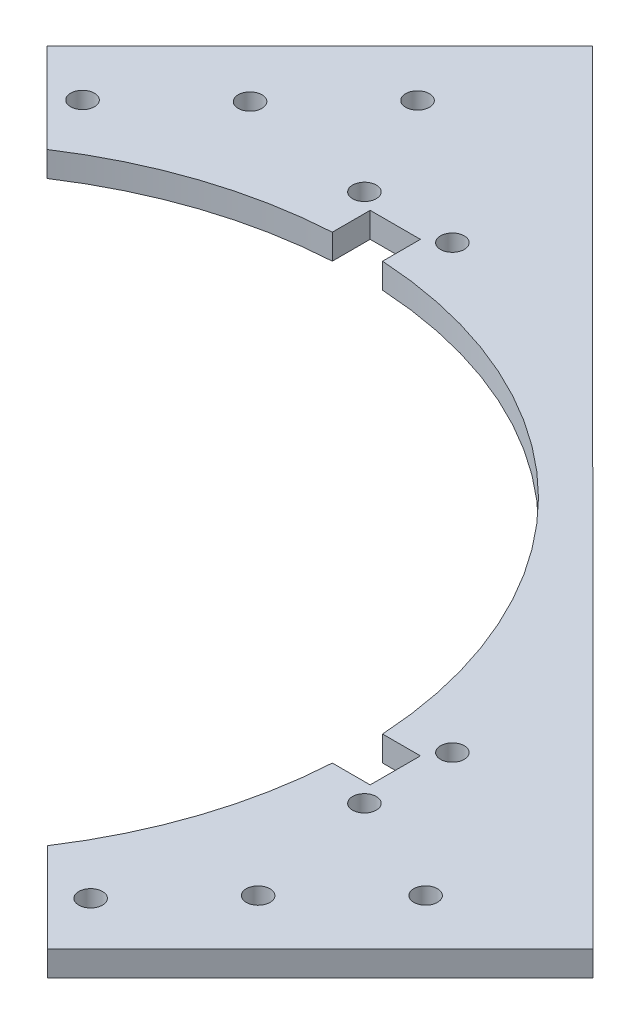
ISO-10303-21;
HEADER;
FILE_DESCRIPTION(('STEP AP214'),'2;1');
FILE_NAME('part.step','',(''),(''),'','','');
FILE_SCHEMA(('AUTOMOTIVE_DESIGN { 1 0 10303 214 1 1 1 1 }'));
ENDSEC;
DATA;
#1=APPLICATION_CONTEXT('core data for automotive mechanical design processes');
#2=APPLICATION_PROTOCOL_DEFINITION('international standard','automotive_design',2000,#1);
#3=PRODUCT_CONTEXT('',#1,'mechanical');
#4=PRODUCT('Part','Part','',(#3));
#5=PRODUCT_RELATED_PRODUCT_CATEGORY('part','',(#4));
#6=PRODUCT_DEFINITION_FORMATION('','',#4);
#7=PRODUCT_DEFINITION_CONTEXT('part definition',#1,'design');
#8=PRODUCT_DEFINITION('design','',#6,#7);
#9=PRODUCT_DEFINITION_SHAPE('','',#8);
#10=(LENGTH_UNIT() NAMED_UNIT(*) SI_UNIT(.MILLI.,.METRE.));
#11=(NAMED_UNIT(*) PLANE_ANGLE_UNIT() SI_UNIT($,.RADIAN.));
#12=(NAMED_UNIT(*) SI_UNIT($,.STERADIAN.) SOLID_ANGLE_UNIT());
#13=UNCERTAINTY_MEASURE_WITH_UNIT(LENGTH_MEASURE(1.E-05),#10,'distance_accuracy_value','');
#14=(GEOMETRIC_REPRESENTATION_CONTEXT(3) GLOBAL_UNCERTAINTY_ASSIGNED_CONTEXT((#13)) GLOBAL_UNIT_ASSIGNED_CONTEXT((#10,
#11,#12)) REPRESENTATION_CONTEXT('',''));
#15=CARTESIAN_POINT('',(0.,0.,0.));
#16=DIRECTION('',(0.,0.,1.));
#17=DIRECTION('',(1.,0.,0.));
#18=AXIS2_PLACEMENT_3D('',#15,#16,#17);
#19=CARTESIAN_POINT('',(0.,3.175,0.));
#20=DIRECTION('',(0.,1.,0.));
#21=DIRECTION('',(0.,0.,1.));
#22=AXIS2_PLACEMENT_3D('',#19,#20,#21);
#23=PLANE('',#22);
#24=DIRECTION('',(-0.707443172401365,0.,-0.706770229864482));
#25=VECTOR('',#24,1.);
#26=CARTESIAN_POINT('',(57.2688897716044,3.175,41.5064383027239));
#27=LINE('',#26,#25);
#28=CARTESIAN_POINT('',(57.2688897716044,3.175,41.5064383027239));
#29=VERTEX_POINT('',#28);
#30=CARTESIAN_POINT('',(45.9608973819119,3.175,30.2092024364988));
#31=VERTEX_POINT('',#30);
#32=EDGE_CURVE('E138',#29,#31,#27,.T.);
#33=ORIENTED_EDGE('',*,*,#32,.F.);
#34=DIRECTION('',(0.706770229864482,0.,-0.707443172401365));
#35=VECTOR('',#34,1.);
#36=CARTESIAN_POINT('',(49.4149055922353,3.175,49.3679005560341));
#37=LINE('',#36,#35);
#38=CARTESIAN_POINT('',(91.7151038496246,3.175,7.02742668781241));
#39=VERTEX_POINT('',#38);
#40=EDGE_CURVE('E149',#29,#39,#37,.T.);
#41=ORIENTED_EDGE('',*,*,#40,.T.);
#42=DIRECTION('',(0.707443172401365,0.,0.706770229864482));
#43=VECTOR('',#42,1.);
#44=CARTESIAN_POINT('',(91.7151038496246,3.175,7.02742668781241));
#45=LINE('',#44,#43);
#46=CARTESIAN_POINT('',(-7.11470733484609,3.175,-91.7083744242558));
#47=VERTEX_POINT('',#46);
#48=EDGE_CURVE('E271',#47,#39,#45,.T.);
#49=ORIENTED_EDGE('',*,*,#48,.F.);
#50=DIRECTION('',(0.706770229864482,0.,-0.707443172401365));
#51=VECTOR('',#50,1.);
#52=CARTESIAN_POINT('',(-49.4149055922353,3.175,-49.3679005560341));
#53=LINE('',#52,#51);
#54=CARTESIAN_POINT('',(-41.5609214128663,3.175,-57.2293628093442));
#55=VERTEX_POINT('',#54);
#56=EDGE_CURVE('E157',#55,#47,#53,.T.);
#57=ORIENTED_EDGE('',*,*,#56,.F.);
#58=CARTESIAN_POINT('',(-30.2529290231738,3.175,-45.9321269431191));
#59=VERTEX_POINT('',#58);
#60=EDGE_CURVE('E60',#59,#55,#27,.T.);
#61=ORIENTED_EDGE('',*,*,#60,.F.);
#62=CARTESIAN_POINT('',(0.,3.175,0.));
#63=DIRECTION('',(0.,1.,0.));
#64=DIRECTION('',(0.,0.,1.));
#65=AXIS2_PLACEMENT_3D('',#62,#63,#64);
#66=CIRCLE('',#65,55.);
#67=CARTESIAN_POINT('',(-3.175,3.175,-54.9082814792086));
#68=VERTEX_POINT('',#67);
#69=EDGE_CURVE('E174',#68,#59,#66,.T.);
#70=ORIENTED_EDGE('',*,*,#69,.F.);
#71=DIRECTION('',(0.,0.,1.));
#72=VECTOR('',#71,1.);
#73=CARTESIAN_POINT('',(-3.175,3.175,-53.34));
#74=LINE('',#73,#72);
#75=CARTESIAN_POINT('',(-3.175,3.175,-59.69));
#76=VERTEX_POINT('',#75);
#77=EDGE_CURVE('E237',#76,#68,#74,.T.);
#78=ORIENTED_EDGE('',*,*,#77,.F.);
#79=DIRECTION('',(-1.,0.,0.));
#80=VECTOR('',#79,1.);
#81=CARTESIAN_POINT('',(3.175,3.175,-59.69));
#82=LINE('',#81,#80);
#83=CARTESIAN_POINT('',(3.175,3.175,-59.69));
#84=VERTEX_POINT('',#83);
#85=EDGE_CURVE('E317',#84,#76,#82,.T.);
#86=ORIENTED_EDGE('',*,*,#85,.F.);
#87=DIRECTION('',(0.,0.,-1.));
#88=VECTOR('',#87,1.);
#89=CARTESIAN_POINT('',(3.175,3.175,-53.34));
#90=LINE('',#89,#88);
#91=CARTESIAN_POINT('',(3.175,3.175,-54.9082814792086));
#92=VERTEX_POINT('',#91);
#93=EDGE_CURVE('E315',#92,#84,#90,.T.);
#94=ORIENTED_EDGE('',*,*,#93,.F.);
#95=CARTESIAN_POINT('',(54.9082814792086,3.175,-3.17499999999981));
#96=VERTEX_POINT('',#95);
#97=EDGE_CURVE('E177',#96,#92,#66,.T.);
#98=ORIENTED_EDGE('',*,*,#97,.F.);
#99=DIRECTION('',(-1.,0.,0.));
#100=VECTOR('',#99,1.);
#101=CARTESIAN_POINT('',(53.3400000000014,3.175,-3.17499999999981));
#102=LINE('',#101,#100);
#103=CARTESIAN_POINT('',(59.6900000000014,3.175,-3.17499999999981));
#104=VERTEX_POINT('',#103);
#105=EDGE_CURVE('E325',#104,#96,#102,.T.);
#106=ORIENTED_EDGE('',*,*,#105,.F.);
#107=DIRECTION('',(0.,0.,-1.));
#108=VECTOR('',#107,1.);
#109=CARTESIAN_POINT('',(59.6900000000014,3.175,3.17500000000019));
#110=LINE('',#109,#108);
#111=CARTESIAN_POINT('',(59.6900000000014,3.175,3.17500000000019));
#112=VERTEX_POINT('',#111);
#113=EDGE_CURVE('E328',#112,#104,#110,.T.);
#114=ORIENTED_EDGE('',*,*,#113,.F.);
#115=DIRECTION('',(1.,0.,0.));
#116=VECTOR('',#115,1.);
#117=CARTESIAN_POINT('',(53.3400000000014,3.175,3.17500000000019));
#118=LINE('',#117,#116);
#119=CARTESIAN_POINT('',(54.9082814792086,3.175,3.17500000000019));
#120=VERTEX_POINT('',#119);
#121=EDGE_CURVE('E311',#120,#112,#118,.T.);
#122=ORIENTED_EDGE('',*,*,#121,.F.);
#123=EDGE_CURVE('E152',#31,#120,#66,.T.);
#124=ORIENTED_EDGE('',*,*,#123,.F.);
#125=EDGE_LOOP('',(#33,#41,#49,#57,#61,#70,#78,#86,#94,#98,#106,#114,#122,#124));
#126=FACE_BOUND('',#125,.T.);
#127=CARTESIAN_POINT('',(75.300110897104,3.175,11.7781569073365));
#128=DIRECTION('',(0.,1.,0.));
#129=DIRECTION('',(0.,0.,1.));
#130=AXIS2_PLACEMENT_3D('',#127,#128,#129);
#131=CIRCLE('',#130,1.5);
#132=CARTESIAN_POINT('',(75.300110897104,3.175,13.2781569073365));
#133=VERTEX_POINT('',#132);
#134=EDGE_CURVE('E272',#133,#133,#131,.T.);
#135=ORIENTED_EDGE('',*,*,#134,.F.);
#136=EDGE_LOOP('',(#135));
#137=FACE_BOUND('',#136,.T.);
#138=CARTESIAN_POINT('',(-12.2022381603849,3.175,-74.7025636613189));
#139=DIRECTION('',(0.,-1.,0.));
#140=DIRECTION('',(0.,0.,-1.));
#141=AXIS2_PLACEMENT_3D('',#138,#139,#140);
#142=CIRCLE('',#141,1.5);
#143=CARTESIAN_POINT('',(-12.2022381603849,3.175,-76.2025636613189));
#144=VERTEX_POINT('',#143);
#145=EDGE_CURVE('E276',#144,#144,#142,.T.);
#146=ORIENTED_EDGE('',*,*,#145,.T.);
#147=EDGE_LOOP('',(#146));
#148=FACE_BOUND('',#147,.T.);
#149=CARTESIAN_POINT('',(61.346730494,3.175,5.55625));
#150=DIRECTION('',(0.,1.,0.));
#151=DIRECTION('',(0.,0.,1.));
#152=AXIS2_PLACEMENT_3D('',#149,#150,#151);
#153=CIRCLE('',#152,1.5);
#154=CARTESIAN_POINT('',(61.346730494,3.175,7.05625));
#155=VERTEX_POINT('',#154);
#156=EDGE_CURVE('E180',#155,#155,#153,.T.);
#157=ORIENTED_EDGE('',*,*,#156,.F.);
#158=EDGE_LOOP('',(#157));
#159=FACE_BOUND('',#158,.T.);
#160=CARTESIAN_POINT('',(61.346730494,3.175,-5.55625));
#161=DIRECTION('',(0.,1.,0.));
#162=DIRECTION('',(0.,0.,1.));
#163=AXIS2_PLACEMENT_3D('',#160,#161,#162);
#164=CIRCLE('',#163,1.5);
#165=CARTESIAN_POINT('',(61.346730494,3.175,-4.05625));
#166=VERTEX_POINT('',#165);
#167=EDGE_CURVE('E176',#166,#166,#164,.T.);
#168=ORIENTED_EDGE('',*,*,#167,.F.);
#169=EDGE_LOOP('',(#168));
#170=FACE_BOUND('',#169,.T.);
#171=CARTESIAN_POINT('',(5.55625,3.175,-61.346730494));
#172=DIRECTION('',(0.,1.,0.));
#173=DIRECTION('',(0.,0.,1.));
#174=AXIS2_PLACEMENT_3D('',#171,#172,#173);
#175=CIRCLE('',#174,1.5);
#176=CARTESIAN_POINT('',(5.55625,3.175,-59.846730494));
#177=VERTEX_POINT('',#176);
#178=EDGE_CURVE('E171',#177,#177,#175,.T.);
#179=ORIENTED_EDGE('',*,*,#178,.F.);
#180=EDGE_LOOP('',(#179));
#181=FACE_BOUND('',#180,.T.);
#182=CARTESIAN_POINT('',(-5.55625,3.175,-61.346730494));
#183=DIRECTION('',(0.,1.,0.));
#184=DIRECTION('',(0.,0.,1.));
#185=AXIS2_PLACEMENT_3D('',#182,#183,#184);
#186=CIRCLE('',#185,1.5);
#187=CARTESIAN_POINT('',(-5.55625,3.175,-59.846730494));
#188=VERTEX_POINT('',#187);
#189=EDGE_CURVE('E160',#188,#188,#186,.T.);
#190=ORIENTED_EDGE('',*,*,#189,.F.);
#191=EDGE_LOOP('',(#190));
#192=FACE_BOUND('',#191,.T.);
#193=CARTESIAN_POINT('',(54.443600684956,3.175,33.2417034868411));
#194=DIRECTION('',(0.,1.,0.));
#195=DIRECTION('',(0.,0.,1.));
#196=AXIS2_PLACEMENT_3D('',#193,#194,#195);
#197=CIRCLE('',#196,1.5);
#198=CARTESIAN_POINT('',(54.443600684956,3.175,34.7417034868411));
#199=VERTEX_POINT('',#198);
#200=EDGE_CURVE('E289',#199,#199,#197,.T.);
#201=ORIENTED_EDGE('',*,*,#200,.F.);
#202=EDGE_LOOP('',(#201));
#203=FACE_BOUND('',#202,.T.);
#204=CARTESIAN_POINT('',(64.7250613327567,3.175,22.3632753743919));
#205=DIRECTION('',(0.,1.,0.));
#206=DIRECTION('',(0.,0.,1.));
#207=AXIS2_PLACEMENT_3D('',#204,#205,#206);
#208=CIRCLE('',#207,1.5);
#209=CARTESIAN_POINT('',(64.7250613327567,3.175,23.8632753743919));
#210=VERTEX_POINT('',#209);
#211=EDGE_CURVE('E275',#210,#210,#208,.T.);
#212=ORIENTED_EDGE('',*,*,#211,.F.);
#213=EDGE_LOOP('',(#212));
#214=FACE_BOUND('',#213,.T.);
#215=CARTESIAN_POINT('',(-22.6624376065215,3.175,-64.003936001799));
#216=DIRECTION('',(0.,-1.,0.));
#217=DIRECTION('',(0.,0.,-1.));
#218=AXIS2_PLACEMENT_3D('',#215,#216,#217);
#219=CIRCLE('',#218,1.5);
#220=CARTESIAN_POINT('',(-22.6624376065215,3.175,-65.503936001799));
#221=VERTEX_POINT('',#220);
#222=EDGE_CURVE('E295',#221,#221,#219,.T.);
#223=ORIENTED_EDGE('',*,*,#222,.T.);
#224=EDGE_LOOP('',(#223));
#225=FACE_BOUND('',#224,.T.);
#226=CARTESIAN_POINT('',(-33.4193742609255,3.175,-53.5954325040266));
#227=DIRECTION('',(0.,-1.,0.));
#228=DIRECTION('',(0.,0.,-1.));
#229=AXIS2_PLACEMENT_3D('',#226,#227,#228);
#230=CIRCLE('',#229,1.50000000000001);
#231=CARTESIAN_POINT('',(-33.4193742609255,3.175,-55.0954325040266));
#232=VERTEX_POINT('',#231);
#233=EDGE_CURVE('E283',#232,#232,#230,.T.);
#234=ORIENTED_EDGE('',*,*,#233,.T.);
#235=EDGE_LOOP('',(#234));
#236=FACE_BOUND('',#235,.T.);
#237=ADVANCED_FACE('F37',(#126,#137,#148,#159,#170,#181,#192,#203,#214,#225,#236),#23,.T.);
#238=CARTESIAN_POINT('',(0.,0.,0.));
#239=DIRECTION('',(0.,1.,0.));
#240=DIRECTION('',(0.,0.,1.));
#241=AXIS2_PLACEMENT_3D('',#238,#239,#240);
#242=PLANE('',#241);
#243=CARTESIAN_POINT('',(75.300110897104,0.,11.7781569073365));
#244=DIRECTION('',(0.,1.,0.));
#245=DIRECTION('',(0.,0.,1.));
#246=AXIS2_PLACEMENT_3D('',#243,#244,#245);
#247=CIRCLE('',#246,1.5);
#248=CARTESIAN_POINT('',(75.300110897104,0.,13.2781569073365));
#249=VERTEX_POINT('',#248);
#250=EDGE_CURVE('E268',#249,#249,#247,.T.);
#251=ORIENTED_EDGE('',*,*,#250,.T.);
#252=EDGE_LOOP('',(#251));
#253=FACE_BOUND('',#252,.T.);
#254=CARTESIAN_POINT('',(64.7250613327567,0.,22.3632753743919));
#255=DIRECTION('',(0.,1.,0.));
#256=DIRECTION('',(0.,0.,1.));
#257=AXIS2_PLACEMENT_3D('',#254,#255,#256);
#258=CIRCLE('',#257,1.5);
#259=CARTESIAN_POINT('',(64.7250613327567,0.,23.8632753743919));
#260=VERTEX_POINT('',#259);
#261=EDGE_CURVE('E292',#260,#260,#258,.T.);
#262=ORIENTED_EDGE('',*,*,#261,.T.);
#263=EDGE_LOOP('',(#262));
#264=FACE_BOUND('',#263,.T.);
#265=CARTESIAN_POINT('',(54.443600684956,0.,33.2417034868411));
#266=DIRECTION('',(0.,1.,0.));
#267=DIRECTION('',(0.,0.,1.));
#268=AXIS2_PLACEMENT_3D('',#265,#266,#267);
#269=CIRCLE('',#268,1.5);
#270=CARTESIAN_POINT('',(54.443600684956,0.,34.7417034868411));
#271=VERTEX_POINT('',#270);
#272=EDGE_CURVE('E302',#271,#271,#269,.T.);
#273=ORIENTED_EDGE('',*,*,#272,.T.);
#274=EDGE_LOOP('',(#273));
#275=FACE_BOUND('',#274,.T.);
#276=CARTESIAN_POINT('',(-5.55625,0.,-61.346730494));
#277=DIRECTION('',(0.,1.,0.));
#278=DIRECTION('',(0.,0.,1.));
#279=AXIS2_PLACEMENT_3D('',#276,#277,#278);
#280=CIRCLE('',#279,1.5);
#281=CARTESIAN_POINT('',(-5.55625,0.,-59.846730494));
#282=VERTEX_POINT('',#281);
#283=EDGE_CURVE('E187',#282,#282,#280,.T.);
#284=ORIENTED_EDGE('',*,*,#283,.T.);
#285=EDGE_LOOP('',(#284));
#286=FACE_BOUND('',#285,.T.);
#287=CARTESIAN_POINT('',(5.55625,0.,-61.346730494));
#288=DIRECTION('',(0.,1.,0.));
#289=DIRECTION('',(0.,0.,1.));
#290=AXIS2_PLACEMENT_3D('',#287,#288,#289);
#291=CIRCLE('',#290,1.5);
#292=CARTESIAN_POINT('',(5.55625,0.,-59.846730494));
#293=VERTEX_POINT('',#292);
#294=EDGE_CURVE('E190',#293,#293,#291,.T.);
#295=ORIENTED_EDGE('',*,*,#294,.T.);
#296=EDGE_LOOP('',(#295));
#297=FACE_BOUND('',#296,.T.);
#298=DIRECTION('',(0.706770229864482,0.,-0.707443172401365));
#299=VECTOR('',#298,1.);
#300=CARTESIAN_POINT('',(49.4149055922353,0.,49.3679005560341));
#301=LINE('',#300,#299);
#302=CARTESIAN_POINT('',(57.2688897716044,0.,41.5064383027239));
#303=VERTEX_POINT('',#302);
#304=CARTESIAN_POINT('',(91.7151038496246,0.,7.0274266878124));
#305=VERTEX_POINT('',#304);
#306=EDGE_CURVE('E183',#303,#305,#301,.T.);
#307=ORIENTED_EDGE('',*,*,#306,.F.);
#308=DIRECTION('',(-0.707443172401365,0.,-0.706770229864482));
#309=VECTOR('',#308,1.);
#310=CARTESIAN_POINT('',(7.85398417936903,0.,-7.86146225331015));
#311=LINE('',#310,#309);
#312=CARTESIAN_POINT('',(45.9608973819119,0.,30.2092024364988));
#313=VERTEX_POINT('',#312);
#314=EDGE_CURVE('E52',#303,#313,#311,.T.);
#315=ORIENTED_EDGE('',*,*,#314,.T.);
#316=CARTESIAN_POINT('',(0.,0.,0.));
#317=DIRECTION('',(0.,1.,0.));
#318=DIRECTION('',(0.,0.,1.));
#319=AXIS2_PLACEMENT_3D('',#316,#317,#318);
#320=CIRCLE('',#319,55.);
#321=CARTESIAN_POINT('',(54.9082814792086,0.,3.17500000000019));
#322=VERTEX_POINT('',#321);
#323=EDGE_CURVE('E194',#313,#322,#320,.T.);
#324=ORIENTED_EDGE('',*,*,#323,.T.);
#325=DIRECTION('',(1.,0.,0.));
#326=VECTOR('',#325,1.);
#327=CARTESIAN_POINT('',(0.,0.,3.17500000000019));
#328=LINE('',#327,#326);
#329=CARTESIAN_POINT('',(59.6900000000014,0.,3.17500000000019));
#330=VERTEX_POINT('',#329);
#331=EDGE_CURVE('E45',#322,#330,#328,.T.);
#332=ORIENTED_EDGE('',*,*,#331,.T.);
#333=DIRECTION('',(0.,0.,-1.));
#334=VECTOR('',#333,1.);
#335=CARTESIAN_POINT('',(59.6900000000014,0.,3.17500000000019));
#336=LINE('',#335,#334);
#337=CARTESIAN_POINT('',(59.6900000000014,0.,-3.17499999999981));
#338=VERTEX_POINT('',#337);
#339=EDGE_CURVE('E205',#330,#338,#336,.T.);
#340=ORIENTED_EDGE('',*,*,#339,.T.);
#341=DIRECTION('',(-1.,0.,0.));
#342=VECTOR('',#341,1.);
#343=CARTESIAN_POINT('',(59.6900000000014,0.,-3.17499999999981));
#344=LINE('',#343,#342);
#345=CARTESIAN_POINT('',(54.9082814792086,0.,-3.17499999999981));
#346=VERTEX_POINT('',#345);
#347=EDGE_CURVE('E252',#338,#346,#344,.T.);
#348=ORIENTED_EDGE('',*,*,#347,.T.);
#349=CARTESIAN_POINT('',(3.175,0.,-54.9082814792086));
#350=VERTEX_POINT('',#349);
#351=EDGE_CURVE('E196',#346,#350,#320,.T.);
#352=ORIENTED_EDGE('',*,*,#351,.T.);
#353=DIRECTION('',(0.,0.,-1.));
#354=VECTOR('',#353,1.);
#355=CARTESIAN_POINT('',(3.175,0.,0.));
#356=LINE('',#355,#354);
#357=CARTESIAN_POINT('',(3.175,0.,-59.69));
#358=VERTEX_POINT('',#357);
#359=EDGE_CURVE('E11',#350,#358,#356,.T.);
#360=ORIENTED_EDGE('',*,*,#359,.T.);
#361=DIRECTION('',(-1.,0.,0.));
#362=VECTOR('',#361,1.);
#363=CARTESIAN_POINT('',(3.175,0.,-59.69));
#364=LINE('',#363,#362);
#365=CARTESIAN_POINT('',(-3.175,0.,-59.69));
#366=VERTEX_POINT('',#365);
#367=EDGE_CURVE('E244',#358,#366,#364,.T.);
#368=ORIENTED_EDGE('',*,*,#367,.T.);
#369=DIRECTION('',(0.,0.,1.));
#370=VECTOR('',#369,1.);
#371=CARTESIAN_POINT('',(-3.175,0.,-59.69));
#372=LINE('',#371,#370);
#373=CARTESIAN_POINT('',(-3.175,0.,-54.9082814792086));
#374=VERTEX_POINT('',#373);
#375=EDGE_CURVE('E234',#366,#374,#372,.T.);
#376=ORIENTED_EDGE('',*,*,#375,.T.);
#377=CARTESIAN_POINT('',(-30.2529290231738,0.,-45.9321269431191));
#378=VERTEX_POINT('',#377);
#379=EDGE_CURVE('E193',#374,#378,#320,.T.);
#380=ORIENTED_EDGE('',*,*,#379,.T.);
#381=CARTESIAN_POINT('',(-41.5609214128663,0.,-57.2293628093442));
#382=VERTEX_POINT('',#381);
#383=EDGE_CURVE('E266',#378,#382,#311,.T.);
#384=ORIENTED_EDGE('',*,*,#383,.T.);
#385=DIRECTION('',(0.706770229864482,0.,-0.707443172401365));
#386=VECTOR('',#385,1.);
#387=CARTESIAN_POINT('',(-49.4149055922353,0.,-49.3679005560341));
#388=LINE('',#387,#386);
#389=CARTESIAN_POINT('',(-7.11470733484609,0.,-91.7083744242558));
#390=VERTEX_POINT('',#389);
#391=EDGE_CURVE('E185',#382,#390,#388,.T.);
#392=ORIENTED_EDGE('',*,*,#391,.T.);
#393=DIRECTION('',(0.707443172401365,0.,0.706770229864482));
#394=VECTOR('',#393,1.);
#395=CARTESIAN_POINT('',(91.7151038496246,0.,7.02742668781241));
#396=LINE('',#395,#394);
#397=EDGE_CURVE('E305',#390,#305,#396,.T.);
#398=ORIENTED_EDGE('',*,*,#397,.T.);
#399=EDGE_LOOP('',(#307,#315,#324,#332,#340,#348,#352,#360,#368,#376,#380,#384,#392,#398));
#400=FACE_BOUND('',#399,.T.);
#401=CARTESIAN_POINT('',(61.346730494,0.,-5.55625));
#402=DIRECTION('',(0.,1.,0.));
#403=DIRECTION('',(0.,0.,1.));
#404=AXIS2_PLACEMENT_3D('',#401,#402,#403);
#405=CIRCLE('',#404,1.5);
#406=CARTESIAN_POINT('',(61.346730494,0.,-4.05625));
#407=VERTEX_POINT('',#406);
#408=EDGE_CURVE('E163',#407,#407,#405,.T.);
#409=ORIENTED_EDGE('',*,*,#408,.T.);
#410=EDGE_LOOP('',(#409));
#411=FACE_BOUND('',#410,.T.);
#412=CARTESIAN_POINT('',(61.346730494,0.,5.55625));
#413=DIRECTION('',(0.,1.,0.));
#414=DIRECTION('',(0.,0.,1.));
#415=AXIS2_PLACEMENT_3D('',#412,#413,#414);
#416=CIRCLE('',#415,1.5);
#417=CARTESIAN_POINT('',(61.346730494,0.,7.05625));
#418=VERTEX_POINT('',#417);
#419=EDGE_CURVE('E158',#418,#418,#416,.T.);
#420=ORIENTED_EDGE('',*,*,#419,.T.);
#421=EDGE_LOOP('',(#420));
#422=FACE_BOUND('',#421,.T.);
#423=CARTESIAN_POINT('',(-22.6624376065215,0.,-64.003936001799));
#424=DIRECTION('',(0.,-1.,0.));
#425=DIRECTION('',(0.,0.,-1.));
#426=AXIS2_PLACEMENT_3D('',#423,#424,#425);
#427=CIRCLE('',#426,1.5);
#428=CARTESIAN_POINT('',(-22.6624376065215,0.,-65.503936001799));
#429=VERTEX_POINT('',#428);
#430=EDGE_CURVE('E279',#429,#429,#427,.T.);
#431=ORIENTED_EDGE('',*,*,#430,.F.);
#432=EDGE_LOOP('',(#431));
#433=FACE_BOUND('',#432,.T.);
#434=CARTESIAN_POINT('',(-12.2022381603849,0.,-74.7025636613189));
#435=DIRECTION('',(0.,-1.,0.));
#436=DIRECTION('',(0.,0.,-1.));
#437=AXIS2_PLACEMENT_3D('',#434,#435,#436);
#438=CIRCLE('',#437,1.5);
#439=CARTESIAN_POINT('',(-12.2022381603849,0.,-76.2025636613189));
#440=VERTEX_POINT('',#439);
#441=EDGE_CURVE('E280',#440,#440,#438,.T.);
#442=ORIENTED_EDGE('',*,*,#441,.F.);
#443=EDGE_LOOP('',(#442));
#444=FACE_BOUND('',#443,.T.);
#445=CARTESIAN_POINT('',(-33.4193742609255,0.,-53.5954325040266));
#446=DIRECTION('',(0.,-1.,0.));
#447=DIRECTION('',(0.,0.,-1.));
#448=AXIS2_PLACEMENT_3D('',#445,#446,#447);
#449=CIRCLE('',#448,1.50000000000001);
#450=CARTESIAN_POINT('',(-33.4193742609255,0.,-55.0954325040266));
#451=VERTEX_POINT('',#450);
#452=EDGE_CURVE('E286',#451,#451,#449,.T.);
#453=ORIENTED_EDGE('',*,*,#452,.F.);
#454=EDGE_LOOP('',(#453));
#455=FACE_BOUND('',#454,.T.);
#456=ADVANCED_FACE('F202',(#253,#264,#275,#286,#297,#400,#411,#422,#433,#444,#455),#242,.F.);
#457=CARTESIAN_POINT('',(0.,3.175,0.));
#458=DIRECTION('',(0.,-1.,0.));
#459=DIRECTION('',(0.,0.,-1.));
#460=AXIS2_PLACEMENT_3D('',#457,#458,#459);
#461=CYLINDRICAL_SURFACE('',#460,55.);
#462=DIRECTION('',(0.,-1.,0.));
#463=VECTOR('',#462,1.);
#464=CARTESIAN_POINT('',(-30.2529290231738,3.175,-45.9321269431191));
#465=LINE('',#464,#463);
#466=EDGE_CURVE('E248',#378,#59,#465,.F.);
#467=ORIENTED_EDGE('',*,*,#466,.F.);
#468=ORIENTED_EDGE('',*,*,#379,.F.);
#469=DIRECTION('',(0.,-1.,0.));
#470=VECTOR('',#469,1.);
#471=CARTESIAN_POINT('',(-3.175,3.175,-54.9082814792086));
#472=LINE('',#471,#470);
#473=EDGE_CURVE('E166',#68,#374,#472,.T.);
#474=ORIENTED_EDGE('',*,*,#473,.F.);
#475=ORIENTED_EDGE('',*,*,#69,.T.);
#476=EDGE_LOOP('',(#467,#468,#474,#475));
#477=FACE_BOUND('',#476,.T.);
#478=ADVANCED_FACE('F247',(#477),#461,.F.);
#479=DIRECTION('',(0.,-1.,0.));
#480=VECTOR('',#479,1.);
#481=CARTESIAN_POINT('',(3.175,3.175,-54.9082814792086));
#482=LINE('',#481,#480);
#483=EDGE_CURVE('E220',#350,#92,#482,.F.);
#484=ORIENTED_EDGE('',*,*,#483,.F.);
#485=ORIENTED_EDGE('',*,*,#351,.F.);
#486=DIRECTION('',(0.,-1.,0.));
#487=VECTOR('',#486,1.);
#488=CARTESIAN_POINT('',(54.9082814792086,3.175,-3.17499999999981));
#489=LINE('',#488,#487);
#490=EDGE_CURVE('E217',#96,#346,#489,.T.);
#491=ORIENTED_EDGE('',*,*,#490,.F.);
#492=ORIENTED_EDGE('',*,*,#97,.T.);
#493=EDGE_LOOP('',(#484,#485,#491,#492));
#494=FACE_BOUND('',#493,.T.);
#495=ADVANCED_FACE('F255',(#494),#461,.F.);
#496=DIRECTION('',(0.,-1.,0.));
#497=VECTOR('',#496,1.);
#498=CARTESIAN_POINT('',(45.9608973819119,3.175,30.2092024364988));
#499=LINE('',#498,#497);
#500=EDGE_CURVE('E262',#31,#313,#499,.T.);
#501=ORIENTED_EDGE('',*,*,#500,.F.);
#502=ORIENTED_EDGE('',*,*,#123,.T.);
#503=DIRECTION('',(0.,-1.,0.));
#504=VECTOR('',#503,1.);
#505=CARTESIAN_POINT('',(54.9082814792086,3.175,3.17500000000019));
#506=LINE('',#505,#504);
#507=EDGE_CURVE('E212',#322,#120,#506,.F.);
#508=ORIENTED_EDGE('',*,*,#507,.F.);
#509=ORIENTED_EDGE('',*,*,#323,.F.);
#510=EDGE_LOOP('',(#501,#502,#508,#509));
#511=FACE_BOUND('',#510,.T.);
#512=ADVANCED_FACE('F216',(#511),#461,.F.);
#513=CARTESIAN_POINT('',(49.4149055922353,3.175,49.3679005560341));
#514=DIRECTION('',(-0.707443172401365,0.,-0.706770229864482));
#515=DIRECTION('',(-0.706770229864482,0.,0.707443172401365));
#516=AXIS2_PLACEMENT_3D('',#513,#514,#515);
#517=PLANE('',#516);
#518=ORIENTED_EDGE('',*,*,#40,.F.);
#519=DIRECTION('',(0.,1.,0.));
#520=VECTOR('',#519,1.);
#521=CARTESIAN_POINT('',(57.2688897716044,-6.825,41.5064383027239));
#522=LINE('',#521,#520);
#523=EDGE_CURVE('E135',#303,#29,#522,.T.);
#524=ORIENTED_EDGE('',*,*,#523,.F.);
#525=ORIENTED_EDGE('',*,*,#306,.T.);
#526=DIRECTION('',(0.,1.,0.));
#527=VECTOR('',#526,1.);
#528=CARTESIAN_POINT('',(91.7151038496246,0.,7.02742668781241));
#529=LINE('',#528,#527);
#530=EDGE_CURVE('E156',#305,#39,#529,.T.);
#531=ORIENTED_EDGE('',*,*,#530,.T.);
#532=EDGE_LOOP('',(#518,#524,#525,#531));
#533=FACE_BOUND('',#532,.T.);
#534=ADVANCED_FACE('F39',(#533),#517,.F.);
#535=CARTESIAN_POINT('',(61.346730494,3.175,5.55625));
#536=DIRECTION('',(0.,-1.,0.));
#537=DIRECTION('',(0.,0.,-1.));
#538=AXIS2_PLACEMENT_3D('',#535,#536,#537);
#539=CYLINDRICAL_SURFACE('',#538,1.5);
#540=ORIENTED_EDGE('',*,*,#156,.T.);
#541=EDGE_LOOP('',(#540));
#542=FACE_BOUND('',#541,.T.);
#543=ORIENTED_EDGE('',*,*,#419,.F.);
#544=EDGE_LOOP('',(#543));
#545=FACE_BOUND('',#544,.T.);
#546=ADVANCED_FACE('F356',(#542,#545),#539,.F.);
#547=CARTESIAN_POINT('',(61.346730494,3.175,-5.55625));
#548=DIRECTION('',(0.,-1.,0.));
#549=DIRECTION('',(0.,0.,-1.));
#550=AXIS2_PLACEMENT_3D('',#547,#548,#549);
#551=CYLINDRICAL_SURFACE('',#550,1.5);
#552=ORIENTED_EDGE('',*,*,#167,.T.);
#553=EDGE_LOOP('',(#552));
#554=FACE_BOUND('',#553,.T.);
#555=ORIENTED_EDGE('',*,*,#408,.F.);
#556=EDGE_LOOP('',(#555));
#557=FACE_BOUND('',#556,.T.);
#558=ADVANCED_FACE('F359',(#554,#557),#551,.F.);
#559=CARTESIAN_POINT('',(5.55625,3.175,-61.346730494));
#560=DIRECTION('',(0.,-1.,0.));
#561=DIRECTION('',(0.,0.,-1.));
#562=AXIS2_PLACEMENT_3D('',#559,#560,#561);
#563=CYLINDRICAL_SURFACE('',#562,1.5);
#564=ORIENTED_EDGE('',*,*,#178,.T.);
#565=EDGE_LOOP('',(#564));
#566=FACE_BOUND('',#565,.T.);
#567=ORIENTED_EDGE('',*,*,#294,.F.);
#568=EDGE_LOOP('',(#567));
#569=FACE_BOUND('',#568,.T.);
#570=ADVANCED_FACE('F363',(#566,#569),#563,.F.);
#571=CARTESIAN_POINT('',(-5.55625,3.175,-61.346730494));
#572=DIRECTION('',(0.,-1.,0.));
#573=DIRECTION('',(0.,0.,-1.));
#574=AXIS2_PLACEMENT_3D('',#571,#572,#573);
#575=CYLINDRICAL_SURFACE('',#574,1.5);
#576=ORIENTED_EDGE('',*,*,#189,.T.);
#577=EDGE_LOOP('',(#576));
#578=FACE_BOUND('',#577,.T.);
#579=ORIENTED_EDGE('',*,*,#283,.F.);
#580=EDGE_LOOP('',(#579));
#581=FACE_BOUND('',#580,.T.);
#582=ADVANCED_FACE('F344',(#578,#581),#575,.F.);
#583=CARTESIAN_POINT('',(-49.4149055922353,3.175,-49.3679005560341));
#584=DIRECTION('',(-0.707443172401365,0.,-0.706770229864482));
#585=DIRECTION('',(-0.706770229864482,0.,0.707443172401365));
#586=AXIS2_PLACEMENT_3D('',#583,#584,#585);
#587=PLANE('',#586);
#588=DIRECTION('',(0.,1.,0.));
#589=VECTOR('',#588,1.);
#590=CARTESIAN_POINT('',(-41.5609214128663,-6.825,-57.2293628093442));
#591=LINE('',#590,#589);
#592=EDGE_CURVE('E143',#382,#55,#591,.T.);
#593=ORIENTED_EDGE('',*,*,#592,.T.);
#594=ORIENTED_EDGE('',*,*,#56,.T.);
#595=DIRECTION('',(0.,1.,0.));
#596=VECTOR('',#595,1.);
#597=CARTESIAN_POINT('',(-7.11470733484609,0.,-91.7083744242558));
#598=LINE('',#597,#596);
#599=EDGE_CURVE('E308',#390,#47,#598,.T.);
#600=ORIENTED_EDGE('',*,*,#599,.F.);
#601=ORIENTED_EDGE('',*,*,#391,.F.);
#602=EDGE_LOOP('',(#593,#594,#600,#601));
#603=FACE_BOUND('',#602,.T.);
#604=ADVANCED_FACE('F337',(#603),#587,.T.);
#605=CARTESIAN_POINT('',(53.3400000000014,0.,-3.17499999999981));
#606=DIRECTION('',(0.,0.,-1.));
#607=DIRECTION('',(-1.,0.,0.));
#608=AXIS2_PLACEMENT_3D('',#605,#606,#607);
#609=PLANE('',#608);
#610=ORIENTED_EDGE('',*,*,#490,.T.);
#611=ORIENTED_EDGE('',*,*,#347,.F.);
#612=DIRECTION('',(0.,1.,0.));
#613=VECTOR('',#612,1.);
#614=CARTESIAN_POINT('',(59.6900000000014,0.,-3.17499999999981));
#615=LINE('',#614,#613);
#616=EDGE_CURVE('E318',#338,#104,#615,.T.);
#617=ORIENTED_EDGE('',*,*,#616,.T.);
#618=ORIENTED_EDGE('',*,*,#105,.T.);
#619=EDGE_LOOP('',(#610,#611,#617,#618));
#620=FACE_BOUND('',#619,.T.);
#621=ADVANCED_FACE('F335',(#620),#609,.F.);
#622=CARTESIAN_POINT('',(59.6900000000014,0.,3.17500000000019));
#623=DIRECTION('',(1.,0.,0.));
#624=DIRECTION('',(0.,0.,-1.));
#625=AXIS2_PLACEMENT_3D('',#622,#623,#624);
#626=PLANE('',#625);
#627=ORIENTED_EDGE('',*,*,#113,.T.);
#628=ORIENTED_EDGE('',*,*,#616,.F.);
#629=ORIENTED_EDGE('',*,*,#339,.F.);
#630=DIRECTION('',(0.,1.,0.));
#631=VECTOR('',#630,1.);
#632=CARTESIAN_POINT('',(59.6900000000014,0.,3.17500000000019));
#633=LINE('',#632,#631);
#634=EDGE_CURVE('E214',#330,#112,#633,.T.);
#635=ORIENTED_EDGE('',*,*,#634,.T.);
#636=EDGE_LOOP('',(#627,#628,#629,#635));
#637=FACE_BOUND('',#636,.T.);
#638=ADVANCED_FACE('F334',(#637),#626,.F.);
#639=CARTESIAN_POINT('',(53.3400000000014,0.,3.17500000000019));
#640=DIRECTION('',(0.,0.,1.));
#641=DIRECTION('',(1.,0.,0.));
#642=AXIS2_PLACEMENT_3D('',#639,#640,#641);
#643=PLANE('',#642);
#644=ORIENTED_EDGE('',*,*,#507,.T.);
#645=ORIENTED_EDGE('',*,*,#121,.T.);
#646=ORIENTED_EDGE('',*,*,#634,.F.);
#647=ORIENTED_EDGE('',*,*,#331,.F.);
#648=EDGE_LOOP('',(#644,#645,#646,#647));
#649=FACE_BOUND('',#648,.T.);
#650=ADVANCED_FACE('F211',(#649),#643,.F.);
#651=CARTESIAN_POINT('',(-3.175,0.,-53.34));
#652=DIRECTION('',(-1.,0.,0.));
#653=DIRECTION('',(0.,0.,1.));
#654=AXIS2_PLACEMENT_3D('',#651,#652,#653);
#655=PLANE('',#654);
#656=ORIENTED_EDGE('',*,*,#473,.T.);
#657=ORIENTED_EDGE('',*,*,#375,.F.);
#658=DIRECTION('',(0.,1.,0.));
#659=VECTOR('',#658,1.);
#660=CARTESIAN_POINT('',(-3.175,0.,-59.69));
#661=LINE('',#660,#659);
#662=EDGE_CURVE('E218',#366,#76,#661,.T.);
#663=ORIENTED_EDGE('',*,*,#662,.T.);
#664=ORIENTED_EDGE('',*,*,#77,.T.);
#665=EDGE_LOOP('',(#656,#657,#663,#664));
#666=FACE_BOUND('',#665,.T.);
#667=ADVANCED_FACE('F233',(#666),#655,.F.);
#668=CARTESIAN_POINT('',(3.175,0.,-59.69));
#669=DIRECTION('',(0.,0.,-1.));
#670=DIRECTION('',(-1.,0.,0.));
#671=AXIS2_PLACEMENT_3D('',#668,#669,#670);
#672=PLANE('',#671);
#673=ORIENTED_EDGE('',*,*,#85,.T.);
#674=ORIENTED_EDGE('',*,*,#662,.F.);
#675=ORIENTED_EDGE('',*,*,#367,.F.);
#676=DIRECTION('',(0.,1.,0.));
#677=VECTOR('',#676,1.);
#678=CARTESIAN_POINT('',(3.175,0.,-59.69));
#679=LINE('',#678,#677);
#680=EDGE_CURVE('E222',#358,#84,#679,.T.);
#681=ORIENTED_EDGE('',*,*,#680,.T.);
#682=EDGE_LOOP('',(#673,#674,#675,#681));
#683=FACE_BOUND('',#682,.T.);
#684=ADVANCED_FACE('F426',(#683),#672,.F.);
#685=CARTESIAN_POINT('',(3.175,0.,-53.34));
#686=DIRECTION('',(1.,0.,0.));
#687=DIRECTION('',(0.,0.,-1.));
#688=AXIS2_PLACEMENT_3D('',#685,#686,#687);
#689=PLANE('',#688);
#690=ORIENTED_EDGE('',*,*,#483,.T.);
#691=ORIENTED_EDGE('',*,*,#93,.T.);
#692=ORIENTED_EDGE('',*,*,#680,.F.);
#693=ORIENTED_EDGE('',*,*,#359,.F.);
#694=EDGE_LOOP('',(#690,#691,#692,#693));
#695=FACE_BOUND('',#694,.T.);
#696=ADVANCED_FACE('F422',(#695),#689,.F.);
#697=CARTESIAN_POINT('',(91.7151038496246,0.,7.02742668781241));
#698=DIRECTION('',(-0.706770229864482,0.,0.707443172401365));
#699=DIRECTION('',(0.707443172401365,0.,0.706770229864482));
#700=AXIS2_PLACEMENT_3D('',#697,#698,#699);
#701=PLANE('',#700);
#702=ORIENTED_EDGE('',*,*,#48,.T.);
#703=ORIENTED_EDGE('',*,*,#530,.F.);
#704=ORIENTED_EDGE('',*,*,#397,.F.);
#705=ORIENTED_EDGE('',*,*,#599,.T.);
#706=EDGE_LOOP('',(#702,#703,#704,#705));
#707=FACE_BOUND('',#706,.T.);
#708=ADVANCED_FACE('F418',(#707),#701,.F.);
#709=CARTESIAN_POINT('',(54.443600684956,0.,33.2417034868411));
#710=DIRECTION('',(0.,1.,0.));
#711=DIRECTION('',(0.,0.,1.));
#712=AXIS2_PLACEMENT_3D('',#709,#710,#711);
#713=CYLINDRICAL_SURFACE('',#712,1.5);
#714=ORIENTED_EDGE('',*,*,#272,.F.);
#715=EDGE_LOOP('',(#714));
#716=FACE_BOUND('',#715,.T.);
#717=ORIENTED_EDGE('',*,*,#200,.T.);
#718=EDGE_LOOP('',(#717));
#719=FACE_BOUND('',#718,.T.);
#720=ADVANCED_FACE('F411',(#716,#719),#713,.F.);
#721=CARTESIAN_POINT('',(64.7250613327567,0.,22.3632753743919));
#722=DIRECTION('',(0.,1.,0.));
#723=DIRECTION('',(0.,0.,1.));
#724=AXIS2_PLACEMENT_3D('',#721,#722,#723);
#725=CYLINDRICAL_SURFACE('',#724,1.5);
#726=ORIENTED_EDGE('',*,*,#261,.F.);
#727=EDGE_LOOP('',(#726));
#728=FACE_BOUND('',#727,.T.);
#729=ORIENTED_EDGE('',*,*,#211,.T.);
#730=EDGE_LOOP('',(#729));
#731=FACE_BOUND('',#730,.T.);
#732=ADVANCED_FACE('F408',(#728,#731),#725,.F.);
#733=CARTESIAN_POINT('',(-22.6624376065215,0.,-64.003936001799));
#734=DIRECTION('',(0.,1.,0.));
#735=DIRECTION('',(0.,0.,1.));
#736=AXIS2_PLACEMENT_3D('',#733,#734,#735);
#737=CYLINDRICAL_SURFACE('',#736,1.5);
#738=ORIENTED_EDGE('',*,*,#430,.T.);
#739=EDGE_LOOP('',(#738));
#740=FACE_BOUND('',#739,.T.);
#741=ORIENTED_EDGE('',*,*,#222,.F.);
#742=EDGE_LOOP('',(#741));
#743=FACE_BOUND('',#742,.T.);
#744=ADVANCED_FACE('F404',(#740,#743),#737,.F.);
#745=CARTESIAN_POINT('',(-12.2022381603849,0.,-74.7025636613189));
#746=DIRECTION('',(0.,1.,0.));
#747=DIRECTION('',(0.,0.,1.));
#748=AXIS2_PLACEMENT_3D('',#745,#746,#747);
#749=CYLINDRICAL_SURFACE('',#748,1.5);
#750=ORIENTED_EDGE('',*,*,#441,.T.);
#751=EDGE_LOOP('',(#750));
#752=FACE_BOUND('',#751,.T.);
#753=ORIENTED_EDGE('',*,*,#145,.F.);
#754=EDGE_LOOP('',(#753));
#755=FACE_BOUND('',#754,.T.);
#756=ADVANCED_FACE('F394',(#752,#755),#749,.F.);
#757=CARTESIAN_POINT('',(-33.4193742609255,0.,-53.5954325040266));
#758=DIRECTION('',(0.,1.,0.));
#759=DIRECTION('',(0.,0.,1.));
#760=AXIS2_PLACEMENT_3D('',#757,#758,#759);
#761=CYLINDRICAL_SURFACE('',#760,1.50000000000001);
#762=ORIENTED_EDGE('',*,*,#452,.T.);
#763=EDGE_LOOP('',(#762));
#764=FACE_BOUND('',#763,.T.);
#765=ORIENTED_EDGE('',*,*,#233,.F.);
#766=EDGE_LOOP('',(#765));
#767=FACE_BOUND('',#766,.T.);
#768=ADVANCED_FACE('F391',(#764,#767),#761,.F.);
#769=CARTESIAN_POINT('',(75.300110897104,0.,11.7781569073365));
#770=DIRECTION('',(0.,1.,0.));
#771=DIRECTION('',(0.,0.,1.));
#772=AXIS2_PLACEMENT_3D('',#769,#770,#771);
#773=CYLINDRICAL_SURFACE('',#772,1.5);
#774=ORIENTED_EDGE('',*,*,#250,.F.);
#775=EDGE_LOOP('',(#774));
#776=FACE_BOUND('',#775,.T.);
#777=ORIENTED_EDGE('',*,*,#134,.T.);
#778=EDGE_LOOP('',(#777));
#779=FACE_BOUND('',#778,.T.);
#780=ADVANCED_FACE('F393',(#776,#779),#773,.F.);
#781=CARTESIAN_POINT('',(57.2688897716044,-6.825,41.5064383027239));
#782=DIRECTION('',(0.706770229864482,0.,-0.707443172401365));
#783=DIRECTION('',(-0.707443172401365,0.,-0.706770229864482));
#784=AXIS2_PLACEMENT_3D('',#781,#782,#783);
#785=PLANE('',#784);
#786=ORIENTED_EDGE('',*,*,#466,.T.);
#787=ORIENTED_EDGE('',*,*,#60,.T.);
#788=ORIENTED_EDGE('',*,*,#592,.F.);
#789=ORIENTED_EDGE('',*,*,#383,.F.);
#790=EDGE_LOOP('',(#786,#787,#788,#789));
#791=FACE_BOUND('',#790,.T.);
#792=ADVANCED_FACE('F401',(#791),#785,.F.);
#793=ORIENTED_EDGE('',*,*,#523,.T.);
#794=ORIENTED_EDGE('',*,*,#32,.T.);
#795=ORIENTED_EDGE('',*,*,#500,.T.);
#796=ORIENTED_EDGE('',*,*,#314,.F.);
#797=EDGE_LOOP('',(#793,#794,#795,#796));
#798=FACE_BOUND('',#797,.T.);
#799=ADVANCED_FACE('F137',(#798),#785,.F.);
#800=CLOSED_SHELL('',(#237,#456,#478,#495,#512,#534,#546,#558,#570,#582,#604,#621,#638,#650,
#667,#684,#696,#708,#720,#732,#744,#756,#768,#780,#792,#799));
#801=MANIFOLD_SOLID_BREP('B2',#800);
#802=ADVANCED_BREP_SHAPE_REPRESENTATION('',(#18,#801),#14);
#803=SHAPE_DEFINITION_REPRESENTATION(#9,#802);
ENDSEC;
END-ISO-10303-21;
